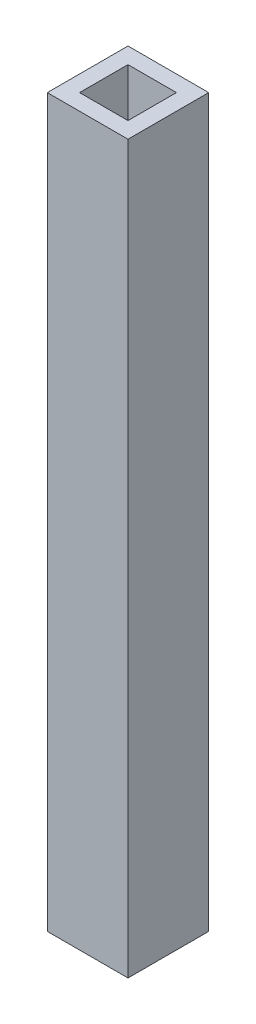
ISO-10303-21;
HEADER;
FILE_DESCRIPTION(('STEP AP214'),'2;1');
FILE_NAME('part.step','',(''),(''),'','','');
FILE_SCHEMA(('AUTOMOTIVE_DESIGN { 1 0 10303 214 1 1 1 1 }'));
ENDSEC;
DATA;
#1=APPLICATION_CONTEXT('core data for automotive mechanical design processes');
#2=APPLICATION_PROTOCOL_DEFINITION('international standard','automotive_design',2000,#1);
#3=PRODUCT_CONTEXT('',#1,'mechanical');
#4=PRODUCT('Part','Part','',(#3));
#5=PRODUCT_RELATED_PRODUCT_CATEGORY('part','',(#4));
#6=PRODUCT_DEFINITION_FORMATION('','',#4);
#7=PRODUCT_DEFINITION_CONTEXT('part definition',#1,'design');
#8=PRODUCT_DEFINITION('design','',#6,#7);
#9=PRODUCT_DEFINITION_SHAPE('','',#8);
#10=(LENGTH_UNIT() NAMED_UNIT(*) SI_UNIT(.MILLI.,.METRE.));
#11=(NAMED_UNIT(*) PLANE_ANGLE_UNIT() SI_UNIT($,.RADIAN.));
#12=(NAMED_UNIT(*) SI_UNIT($,.STERADIAN.) SOLID_ANGLE_UNIT());
#13=UNCERTAINTY_MEASURE_WITH_UNIT(LENGTH_MEASURE(1.E-05),#10,'distance_accuracy_value','');
#14=(GEOMETRIC_REPRESENTATION_CONTEXT(3) GLOBAL_UNCERTAINTY_ASSIGNED_CONTEXT((#13)) GLOBAL_UNIT_ASSIGNED_CONTEXT((#10,
#11,#12)) REPRESENTATION_CONTEXT('',''));
#15=CARTESIAN_POINT('',(0.,0.,0.));
#16=DIRECTION('',(0.,0.,1.));
#17=DIRECTION('',(1.,0.,0.));
#18=AXIS2_PLACEMENT_3D('',#15,#16,#17);
#19=CARTESIAN_POINT('',(0.,90.,0.));
#20=DIRECTION('',(0.,1.,0.));
#21=DIRECTION('',(0.,0.,1.));
#22=AXIS2_PLACEMENT_3D('',#19,#20,#21);
#23=PLANE('',#22);
#24=DIRECTION('',(0.,0.,-1.));
#25=VECTOR('',#24,1.);
#26=CARTESIAN_POINT('',(5.,90.,5.));
#27=LINE('',#26,#25);
#28=CARTESIAN_POINT('',(5.,90.,5.));
#29=VERTEX_POINT('',#28);
#30=CARTESIAN_POINT('',(5.,90.,-5.));
#31=VERTEX_POINT('',#30);
#32=EDGE_CURVE('E162',#29,#31,#27,.T.);
#33=ORIENTED_EDGE('',*,*,#32,.T.);
#34=DIRECTION('',(-1.,0.,0.));
#35=VECTOR('',#34,1.);
#36=CARTESIAN_POINT('',(-5.,90.,-5.));
#37=LINE('',#36,#35);
#38=CARTESIAN_POINT('',(-5.,90.,-5.));
#39=VERTEX_POINT('',#38);
#40=EDGE_CURVE('E165',#31,#39,#37,.T.);
#41=ORIENTED_EDGE('',*,*,#40,.T.);
#42=DIRECTION('',(0.,0.,1.));
#43=VECTOR('',#42,1.);
#44=CARTESIAN_POINT('',(-5.,90.,5.));
#45=LINE('',#44,#43);
#46=CARTESIAN_POINT('',(-5.,90.,5.));
#47=VERTEX_POINT('',#46);
#48=EDGE_CURVE('E168',#39,#47,#45,.T.);
#49=ORIENTED_EDGE('',*,*,#48,.T.);
#50=DIRECTION('',(1.,0.,0.));
#51=VECTOR('',#50,1.);
#52=CARTESIAN_POINT('',(-5.,90.,5.));
#53=LINE('',#52,#51);
#54=EDGE_CURVE('E170',#47,#29,#53,.T.);
#55=ORIENTED_EDGE('',*,*,#54,.T.);
#56=EDGE_LOOP('',(#33,#41,#49,#55));
#57=FACE_BOUND('',#56,.T.);
#58=DIRECTION('',(-1.,0.,0.));
#59=VECTOR('',#58,1.);
#60=CARTESIAN_POINT('',(0.,90.,-3.));
#61=LINE('',#60,#59);
#62=CARTESIAN_POINT('',(3.,90.,-3.));
#63=VERTEX_POINT('',#62);
#64=CARTESIAN_POINT('',(-3.,90.,-3.));
#65=VERTEX_POINT('',#64);
#66=EDGE_CURVE('E134',#63,#65,#61,.T.);
#67=ORIENTED_EDGE('',*,*,#66,.F.);
#68=DIRECTION('',(0.,0.,-1.));
#69=VECTOR('',#68,1.);
#70=CARTESIAN_POINT('',(3.,90.,0.));
#71=LINE('',#70,#69);
#72=CARTESIAN_POINT('',(3.,90.,3.));
#73=VERTEX_POINT('',#72);
#74=EDGE_CURVE('E126',#73,#63,#71,.T.);
#75=ORIENTED_EDGE('',*,*,#74,.F.);
#76=DIRECTION('',(1.,0.,0.));
#77=VECTOR('',#76,1.);
#78=CARTESIAN_POINT('',(0.,90.,3.));
#79=LINE('',#78,#77);
#80=CARTESIAN_POINT('',(-3.,90.,3.));
#81=VERTEX_POINT('',#80);
#82=EDGE_CURVE('E148',#81,#73,#79,.T.);
#83=ORIENTED_EDGE('',*,*,#82,.F.);
#84=DIRECTION('',(0.,0.,1.));
#85=VECTOR('',#84,1.);
#86=CARTESIAN_POINT('',(-3.,90.,0.));
#87=LINE('',#86,#85);
#88=EDGE_CURVE('E146',#65,#81,#87,.T.);
#89=ORIENTED_EDGE('',*,*,#88,.F.);
#90=EDGE_LOOP('',(#67,#75,#83,#89));
#91=FACE_BOUND('',#90,.T.);
#92=ADVANCED_FACE('F61',(#57,#91),#23,.T.);
#93=CARTESIAN_POINT('',(0.,0.,0.));
#94=DIRECTION('',(0.,1.,0.));
#95=DIRECTION('',(0.,0.,1.));
#96=AXIS2_PLACEMENT_3D('',#93,#94,#95);
#97=PLANE('',#96);
#98=DIRECTION('',(0.,0.,-1.));
#99=VECTOR('',#98,1.);
#100=CARTESIAN_POINT('',(5.,0.,5.));
#101=LINE('',#100,#99);
#102=CARTESIAN_POINT('',(5.,0.,5.));
#103=VERTEX_POINT('',#102);
#104=CARTESIAN_POINT('',(5.,0.,-5.));
#105=VERTEX_POINT('',#104);
#106=EDGE_CURVE('E142',#103,#105,#101,.T.);
#107=ORIENTED_EDGE('',*,*,#106,.F.);
#108=DIRECTION('',(1.,0.,0.));
#109=VECTOR('',#108,1.);
#110=CARTESIAN_POINT('',(-5.,0.,5.));
#111=LINE('',#110,#109);
#112=CARTESIAN_POINT('',(-5.,0.,5.));
#113=VERTEX_POINT('',#112);
#114=EDGE_CURVE('E166',#113,#103,#111,.T.);
#115=ORIENTED_EDGE('',*,*,#114,.F.);
#116=DIRECTION('',(0.,0.,1.));
#117=VECTOR('',#116,1.);
#118=CARTESIAN_POINT('',(-5.,0.,5.));
#119=LINE('',#118,#117);
#120=CARTESIAN_POINT('',(-5.,0.,-5.));
#121=VERTEX_POINT('',#120);
#122=EDGE_CURVE('E177',#121,#113,#119,.T.);
#123=ORIENTED_EDGE('',*,*,#122,.F.);
#124=DIRECTION('',(-1.,0.,0.));
#125=VECTOR('',#124,1.);
#126=CARTESIAN_POINT('',(-5.,0.,-5.));
#127=LINE('',#126,#125);
#128=EDGE_CURVE('E175',#105,#121,#127,.T.);
#129=ORIENTED_EDGE('',*,*,#128,.F.);
#130=EDGE_LOOP('',(#107,#115,#123,#129));
#131=FACE_BOUND('',#130,.T.);
#132=DIRECTION('',(0.,0.,-1.));
#133=VECTOR('',#132,1.);
#134=CARTESIAN_POINT('',(3.,0.,0.));
#135=LINE('',#134,#133);
#136=CARTESIAN_POINT('',(3.,0.,3.));
#137=VERTEX_POINT('',#136);
#138=CARTESIAN_POINT('',(3.,0.,-3.));
#139=VERTEX_POINT('',#138);
#140=EDGE_CURVE('E84',#137,#139,#135,.T.);
#141=ORIENTED_EDGE('',*,*,#140,.T.);
#142=DIRECTION('',(-1.,0.,0.));
#143=VECTOR('',#142,1.);
#144=CARTESIAN_POINT('',(0.,0.,-3.));
#145=LINE('',#144,#143);
#146=CARTESIAN_POINT('',(-3.,0.,-3.));
#147=VERTEX_POINT('',#146);
#148=EDGE_CURVE('E141',#139,#147,#145,.T.);
#149=ORIENTED_EDGE('',*,*,#148,.T.);
#150=DIRECTION('',(0.,0.,1.));
#151=VECTOR('',#150,1.);
#152=CARTESIAN_POINT('',(-3.,0.,0.));
#153=LINE('',#152,#151);
#154=CARTESIAN_POINT('',(-3.,0.,3.));
#155=VERTEX_POINT('',#154);
#156=EDGE_CURVE('E154',#147,#155,#153,.T.);
#157=ORIENTED_EDGE('',*,*,#156,.T.);
#158=DIRECTION('',(1.,0.,0.));
#159=VECTOR('',#158,1.);
#160=CARTESIAN_POINT('',(0.,0.,3.));
#161=LINE('',#160,#159);
#162=EDGE_CURVE('E135',#155,#137,#161,.T.);
#163=ORIENTED_EDGE('',*,*,#162,.T.);
#164=EDGE_LOOP('',(#141,#149,#157,#163));
#165=FACE_BOUND('',#164,.T.);
#166=ADVANCED_FACE('F195',(#131,#165),#97,.F.);
#167=CARTESIAN_POINT('',(5.,90.,5.));
#168=DIRECTION('',(-1.,0.,0.));
#169=DIRECTION('',(0.,0.,1.));
#170=AXIS2_PLACEMENT_3D('',#167,#168,#169);
#171=PLANE('',#170);
#172=ORIENTED_EDGE('',*,*,#106,.T.);
#173=DIRECTION('',(0.,-1.,0.));
#174=VECTOR('',#173,1.);
#175=CARTESIAN_POINT('',(5.,90.,-5.));
#176=LINE('',#175,#174);
#177=EDGE_CURVE('E12',#31,#105,#176,.T.);
#178=ORIENTED_EDGE('',*,*,#177,.F.);
#179=ORIENTED_EDGE('',*,*,#32,.F.);
#180=DIRECTION('',(0.,-1.,0.));
#181=VECTOR('',#180,1.);
#182=CARTESIAN_POINT('',(5.,90.,5.));
#183=LINE('',#182,#181);
#184=EDGE_CURVE('E172',#29,#103,#183,.T.);
#185=ORIENTED_EDGE('',*,*,#184,.T.);
#186=EDGE_LOOP('',(#172,#178,#179,#185));
#187=FACE_BOUND('',#186,.T.);
#188=ADVANCED_FACE('F63',(#187),#171,.F.);
#189=CARTESIAN_POINT('',(-5.,90.,-5.));
#190=DIRECTION('',(0.,0.,1.));
#191=DIRECTION('',(1.,0.,0.));
#192=AXIS2_PLACEMENT_3D('',#189,#190,#191);
#193=PLANE('',#192);
#194=ORIENTED_EDGE('',*,*,#128,.T.);
#195=DIRECTION('',(0.,-1.,0.));
#196=VECTOR('',#195,1.);
#197=CARTESIAN_POINT('',(-5.,90.,-5.));
#198=LINE('',#197,#196);
#199=EDGE_CURVE('E69',#39,#121,#198,.T.);
#200=ORIENTED_EDGE('',*,*,#199,.F.);
#201=ORIENTED_EDGE('',*,*,#40,.F.);
#202=ORIENTED_EDGE('',*,*,#177,.T.);
#203=EDGE_LOOP('',(#194,#200,#201,#202));
#204=FACE_BOUND('',#203,.T.);
#205=ADVANCED_FACE('F205',(#204),#193,.F.);
#206=CARTESIAN_POINT('',(-5.,90.,5.));
#207=DIRECTION('',(1.,0.,0.));
#208=DIRECTION('',(0.,0.,-1.));
#209=AXIS2_PLACEMENT_3D('',#206,#207,#208);
#210=PLANE('',#209);
#211=ORIENTED_EDGE('',*,*,#122,.T.);
#212=DIRECTION('',(0.,-1.,0.));
#213=VECTOR('',#212,1.);
#214=CARTESIAN_POINT('',(-5.,90.,5.));
#215=LINE('',#214,#213);
#216=EDGE_CURVE('E182',#47,#113,#215,.T.);
#217=ORIENTED_EDGE('',*,*,#216,.F.);
#218=ORIENTED_EDGE('',*,*,#48,.F.);
#219=ORIENTED_EDGE('',*,*,#199,.T.);
#220=EDGE_LOOP('',(#211,#217,#218,#219));
#221=FACE_BOUND('',#220,.T.);
#222=ADVANCED_FACE('F189',(#221),#210,.F.);
#223=CARTESIAN_POINT('',(-5.,90.,5.));
#224=DIRECTION('',(0.,0.,-1.));
#225=DIRECTION('',(-1.,0.,0.));
#226=AXIS2_PLACEMENT_3D('',#223,#224,#225);
#227=PLANE('',#226);
#228=ORIENTED_EDGE('',*,*,#114,.T.);
#229=ORIENTED_EDGE('',*,*,#184,.F.);
#230=ORIENTED_EDGE('',*,*,#54,.F.);
#231=ORIENTED_EDGE('',*,*,#216,.T.);
#232=EDGE_LOOP('',(#228,#229,#230,#231));
#233=FACE_BOUND('',#232,.T.);
#234=ADVANCED_FACE('F199',(#233),#227,.F.);
#235=CARTESIAN_POINT('',(3.,90.,0.));
#236=DIRECTION('',(-1.,0.,0.));
#237=DIRECTION('',(0.,0.,1.));
#238=AXIS2_PLACEMENT_3D('',#235,#236,#237);
#239=PLANE('',#238);
#240=ORIENTED_EDGE('',*,*,#140,.F.);
#241=DIRECTION('',(0.,-1.,0.));
#242=VECTOR('',#241,1.);
#243=CARTESIAN_POINT('',(3.,90.,3.));
#244=LINE('',#243,#242);
#245=EDGE_CURVE('E130',#73,#137,#244,.T.);
#246=ORIENTED_EDGE('',*,*,#245,.F.);
#247=ORIENTED_EDGE('',*,*,#74,.T.);
#248=DIRECTION('',(0.,-1.,0.));
#249=VECTOR('',#248,1.);
#250=CARTESIAN_POINT('',(3.,90.,-3.));
#251=LINE('',#250,#249);
#252=EDGE_CURVE('E129',#63,#139,#251,.T.);
#253=ORIENTED_EDGE('',*,*,#252,.T.);
#254=EDGE_LOOP('',(#240,#246,#247,#253));
#255=FACE_BOUND('',#254,.T.);
#256=ADVANCED_FACE('F128',(#255),#239,.T.);
#257=CARTESIAN_POINT('',(0.,90.,-3.));
#258=DIRECTION('',(0.,0.,1.));
#259=DIRECTION('',(1.,0.,0.));
#260=AXIS2_PLACEMENT_3D('',#257,#258,#259);
#261=PLANE('',#260);
#262=ORIENTED_EDGE('',*,*,#148,.F.);
#263=ORIENTED_EDGE('',*,*,#252,.F.);
#264=ORIENTED_EDGE('',*,*,#66,.T.);
#265=DIRECTION('',(0.,-1.,0.));
#266=VECTOR('',#265,1.);
#267=CARTESIAN_POINT('',(-3.,90.,-3.));
#268=LINE('',#267,#266);
#269=EDGE_CURVE('E143',#65,#147,#268,.T.);
#270=ORIENTED_EDGE('',*,*,#269,.T.);
#271=EDGE_LOOP('',(#262,#263,#264,#270));
#272=FACE_BOUND('',#271,.T.);
#273=ADVANCED_FACE('F138',(#272),#261,.T.);
#274=CARTESIAN_POINT('',(-3.,90.,0.));
#275=DIRECTION('',(1.,0.,0.));
#276=DIRECTION('',(0.,0.,-1.));
#277=AXIS2_PLACEMENT_3D('',#274,#275,#276);
#278=PLANE('',#277);
#279=ORIENTED_EDGE('',*,*,#156,.F.);
#280=ORIENTED_EDGE('',*,*,#269,.F.);
#281=ORIENTED_EDGE('',*,*,#88,.T.);
#282=DIRECTION('',(0.,-1.,0.));
#283=VECTOR('',#282,1.);
#284=CARTESIAN_POINT('',(-3.,90.,3.));
#285=LINE('',#284,#283);
#286=EDGE_CURVE('E76',#81,#155,#285,.T.);
#287=ORIENTED_EDGE('',*,*,#286,.T.);
#288=EDGE_LOOP('',(#279,#280,#281,#287));
#289=FACE_BOUND('',#288,.T.);
#290=ADVANCED_FACE('F228',(#289),#278,.T.);
#291=CARTESIAN_POINT('',(0.,90.,3.));
#292=DIRECTION('',(0.,0.,-1.));
#293=DIRECTION('',(-1.,0.,0.));
#294=AXIS2_PLACEMENT_3D('',#291,#292,#293);
#295=PLANE('',#294);
#296=ORIENTED_EDGE('',*,*,#162,.F.);
#297=ORIENTED_EDGE('',*,*,#286,.F.);
#298=ORIENTED_EDGE('',*,*,#82,.T.);
#299=ORIENTED_EDGE('',*,*,#245,.T.);
#300=EDGE_LOOP('',(#296,#297,#298,#299));
#301=FACE_BOUND('',#300,.T.);
#302=ADVANCED_FACE('F232',(#301),#295,.T.);
#303=CLOSED_SHELL('',(#92,#166,#188,#205,#222,#234,#256,#273,#290,#302));
#304=MANIFOLD_SOLID_BREP('B2',#303);
#305=ADVANCED_BREP_SHAPE_REPRESENTATION('',(#18,#304),#14);
#306=SHAPE_DEFINITION_REPRESENTATION(#9,#305);
ENDSEC;
END-ISO-10303-21;
